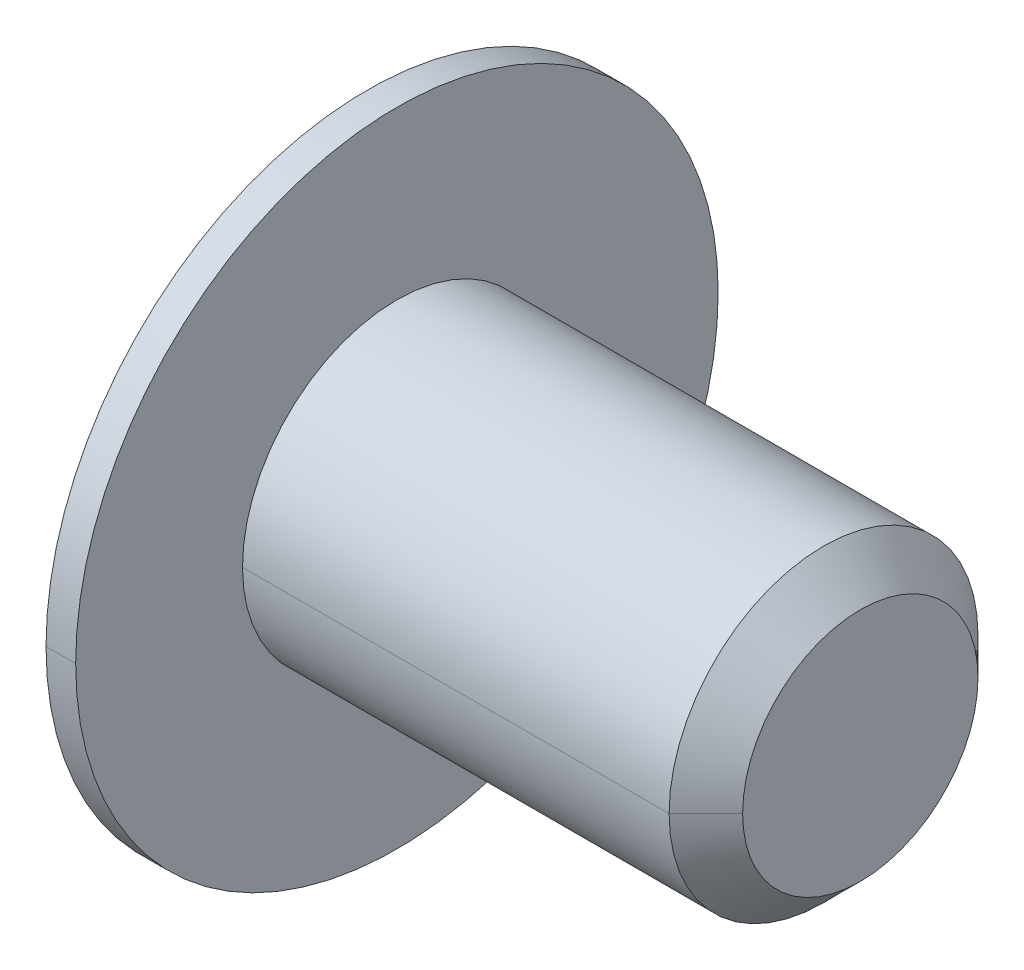
ISO-10303-21;
HEADER;
FILE_DESCRIPTION(('STEP AP214'),'2;1');
FILE_NAME('part.step','',(''),(''),'','','');
FILE_SCHEMA(('AUTOMOTIVE_DESIGN { 1 0 10303 214 1 1 1 1 }'));
ENDSEC;
DATA;
#1=APPLICATION_CONTEXT('core data for automotive mechanical design processes');
#2=APPLICATION_PROTOCOL_DEFINITION('international standard','automotive_design',2000,#1);
#3=PRODUCT_CONTEXT('',#1,'mechanical');
#4=PRODUCT('Part','Part','',(#3));
#5=PRODUCT_RELATED_PRODUCT_CATEGORY('part','',(#4));
#6=PRODUCT_DEFINITION_FORMATION('','',#4);
#7=PRODUCT_DEFINITION_CONTEXT('part definition',#1,'design');
#8=PRODUCT_DEFINITION('design','',#6,#7);
#9=PRODUCT_DEFINITION_SHAPE('','',#8);
#10=(LENGTH_UNIT() NAMED_UNIT(*) SI_UNIT(.MILLI.,.METRE.));
#11=(NAMED_UNIT(*) PLANE_ANGLE_UNIT() SI_UNIT($,.RADIAN.));
#12=(NAMED_UNIT(*) SI_UNIT($,.STERADIAN.) SOLID_ANGLE_UNIT());
#13=UNCERTAINTY_MEASURE_WITH_UNIT(LENGTH_MEASURE(1.E-05),#10,'distance_accuracy_value','');
#14=(GEOMETRIC_REPRESENTATION_CONTEXT(3) GLOBAL_UNCERTAINTY_ASSIGNED_CONTEXT((#13)) GLOBAL_UNIT_ASSIGNED_CONTEXT((#10,
#11,#12)) REPRESENTATION_CONTEXT('',''));
#15=CARTESIAN_POINT('',(0.,0.,0.));
#16=DIRECTION('',(0.,0.,1.));
#17=DIRECTION('',(1.,0.,0.));
#18=AXIS2_PLACEMENT_3D('',#15,#16,#17);
#19=CARTESIAN_POINT('',(-0.609600000000003,0.,5.9436));
#20=CARTESIAN_POINT('',(-0.609600000000003,-11.8872,5.9436));
#21=CARTESIAN_POINT('',(-0.609600000000003,-11.8872,-5.9436));
#22=CARTESIAN_POINT('',(-0.6096,0.,-5.9436));
#23=CARTESIAN_POINT('',(-1.79905906331801,0.,5.06941003668911));
#24=CARTESIAN_POINT('',(-1.79905906331801,-10.1388200733782,5.06941003668911));
#25=CARTESIAN_POINT('',(-1.79905906331801,-10.1388200733782,-5.06941003668911));
#26=CARTESIAN_POINT('',(-1.79905906331801,0.,-5.06941003668911));
#27=CARTESIAN_POINT('',(-2.64203632011339,0.,3.85763023004578));
#28=CARTESIAN_POINT('',(-2.64203632011339,-7.71526046009152,3.85763023004578));
#29=CARTESIAN_POINT('',(-2.64203632011339,-7.71526046009152,-3.85763023004578));
#30=CARTESIAN_POINT('',(-2.64203632011339,0.,-3.85763023004578));
#31=CARTESIAN_POINT('',(-3.048,0.,2.4384));
#32=CARTESIAN_POINT('',(-3.048,-4.8768,2.4384));
#33=CARTESIAN_POINT('',(-3.048,-4.8768,-2.4384));
#34=CARTESIAN_POINT('',(-3.048,0.,-2.4384));
#35=(BOUNDED_SURFACE() B_SPLINE_SURFACE(3,3,((#19,#20,#21,#22),(#23,#24,#25,#26),(#27,#28,#29,
#30),(#31,#32,#33,#34)),.UNSPECIFIED.,.F.,.F.,.F.) B_SPLINE_SURFACE_WITH_KNOTS((4,4),(4,4),(0.,
8.32527599131971),(-67.7080329892993,-44.5622516090247),
.UNSPECIFIED.) GEOMETRIC_REPRESENTATION_ITEM() RATIONAL_B_SPLINE_SURFACE(((1.,0.333333333333333,
0.333333333333333,1.),(0.9642015765525,0.3214005255175,0.3214005255175,0.9642015765525),
(0.9642015765525,0.3214005255175,0.3214005255175,0.9642015765525),(1.,0.333333333333333,
0.333333333333333,1.))) REPRESENTATION_ITEM('') SURFACE());
#36=CARTESIAN_POINT('',(-3.048,0.,0.));
#37=DIRECTION('',(1.,0.,0.));
#38=DIRECTION('',(0.,0.,-1.));
#39=AXIS2_PLACEMENT_3D('',#36,#37,#38);
#40=CIRCLE('',#39,2.4384);
#41=CARTESIAN_POINT('',(-3.048,0.,2.4384));
#42=VERTEX_POINT('',#41);
#43=CARTESIAN_POINT('',(-3.048,0.,-2.4384));
#44=VERTEX_POINT('',#43);
#45=EDGE_CURVE('E11',#42,#44,#40,.T.);
#46=CARTESIAN_POINT('',(-0.6096,0.,-5.9436));
#47=CARTESIAN_POINT('',(-1.79905906331801,0.,-5.06941003668911));
#48=CARTESIAN_POINT('',(-2.64203632011339,0.,-3.85763023004578));
#49=CARTESIAN_POINT('',(-3.048,0.,-2.4384));
#50=(BOUNDED_CURVE() B_SPLINE_CURVE(3,(#46,#47,#48,#49),.UNSPECIFIED.,.F.,
.F.) B_SPLINE_CURVE_WITH_KNOTS((4,4),(0.,8.32527599131971),
.UNSPECIFIED.) CURVE() GEOMETRIC_REPRESENTATION_ITEM() RATIONAL_B_SPLINE_CURVE((1.,
0.9642015765525,0.9642015765525,1.)) REPRESENTATION_ITEM(''));
#51=CARTESIAN_POINT('',(-0.6096,0.,-5.9436));
#52=VERTEX_POINT('',#51);
#53=EDGE_CURVE('E27',#52,#44,#50,.T.);
#54=CARTESIAN_POINT('',(-0.6096,0.,0.));
#55=DIRECTION('',(1.,0.,0.));
#56=DIRECTION('',(0.,0.,-1.));
#57=AXIS2_PLACEMENT_3D('',#54,#55,#56);
#58=CIRCLE('',#57,5.9436);
#59=CARTESIAN_POINT('',(-0.609600000000002,0.,5.9436));
#60=VERTEX_POINT('',#59);
#61=EDGE_CURVE('E327',#60,#52,#58,.T.);
#62=CARTESIAN_POINT('',(-0.609600000000003,0.,5.9436));
#63=CARTESIAN_POINT('',(-1.79905906331801,0.,5.06941003668911));
#64=CARTESIAN_POINT('',(-2.64203632011339,0.,3.85763023004578));
#65=CARTESIAN_POINT('',(-3.048,0.,2.4384));
#66=(BOUNDED_CURVE() B_SPLINE_CURVE(3,(#62,#63,#64,#65),.UNSPECIFIED.,.F.,
.F.) B_SPLINE_CURVE_WITH_KNOTS((4,4),(0.,8.32527599131971),
.UNSPECIFIED.) CURVE() GEOMETRIC_REPRESENTATION_ITEM() RATIONAL_B_SPLINE_CURVE((1.,
0.9642015765525,0.9642015765525,1.)) REPRESENTATION_ITEM(''));
#67=EDGE_CURVE('E315',#60,#42,#66,.T.);
#68=ORIENTED_EDGE('',*,*,#45,.T.);
#69=ORIENTED_EDGE('',*,*,#53,.F.);
#70=ORIENTED_EDGE('',*,*,#61,.F.);
#71=ORIENTED_EDGE('',*,*,#67,.T.);
#72=EDGE_LOOP('',(#68,#69,#70,#71));
#73=FACE_BOUND('',#72,.T.);
#74=ADVANCED_FACE('F16',(#73),#35,.T.);
#75=CARTESIAN_POINT('',(-0.6096,0.,-5.9436));
#76=CARTESIAN_POINT('',(-0.609600000000003,11.8872,-5.9436));
#77=CARTESIAN_POINT('',(-0.609600000000003,11.8872,5.9436));
#78=CARTESIAN_POINT('',(-0.609600000000003,0.,5.9436));
#79=CARTESIAN_POINT('',(-1.79905906331801,0.,-5.06941003668911));
#80=CARTESIAN_POINT('',(-1.79905906331801,10.1388200733782,-5.06941003668911));
#81=CARTESIAN_POINT('',(-1.79905906331801,10.1388200733782,5.06941003668911));
#82=CARTESIAN_POINT('',(-1.79905906331801,0.,5.06941003668911));
#83=CARTESIAN_POINT('',(-2.64203632011339,0.,-3.85763023004578));
#84=CARTESIAN_POINT('',(-2.64203632011339,7.71526046009152,-3.85763023004578));
#85=CARTESIAN_POINT('',(-2.64203632011339,7.71526046009152,3.85763023004578));
#86=CARTESIAN_POINT('',(-2.64203632011339,0.,3.85763023004578));
#87=CARTESIAN_POINT('',(-3.048,0.,-2.4384));
#88=CARTESIAN_POINT('',(-3.048,4.8768,-2.4384));
#89=CARTESIAN_POINT('',(-3.048,4.8768,2.4384));
#90=CARTESIAN_POINT('',(-3.048,0.,2.4384));
#91=(BOUNDED_SURFACE() B_SPLINE_SURFACE(3,3,((#75,#76,#77,#78),(#79,#80,#81,#82),(#83,#84,#85,
#86),(#87,#88,#89,#90)),.UNSPECIFIED.,.F.,.F.,.F.) B_SPLINE_SURFACE_WITH_KNOTS((4,4),(4,4),(0.,
8.32527599131971),(-90.8538143695747,-67.7080329893001),
.UNSPECIFIED.) GEOMETRIC_REPRESENTATION_ITEM() RATIONAL_B_SPLINE_SURFACE(((1.,0.333333333333333,
0.333333333333333,1.),(0.9642015765525,0.3214005255175,0.3214005255175,0.9642015765525),
(0.9642015765525,0.3214005255175,0.3214005255175,0.9642015765525),(1.,0.333333333333333,
0.333333333333333,1.))) REPRESENTATION_ITEM('') SURFACE());
#92=CARTESIAN_POINT('',(-0.6096,0.,0.));
#93=DIRECTION('',(1.,0.,0.));
#94=DIRECTION('',(0.,0.,-1.));
#95=AXIS2_PLACEMENT_3D('',#92,#93,#94);
#96=CIRCLE('',#95,5.9436);
#97=EDGE_CURVE('E312',#52,#60,#96,.T.);
#98=CARTESIAN_POINT('',(-3.048,0.,0.));
#99=DIRECTION('',(1.,0.,0.));
#100=DIRECTION('',(0.,0.,-1.));
#101=AXIS2_PLACEMENT_3D('',#98,#99,#100);
#102=CIRCLE('',#101,2.4384);
#103=EDGE_CURVE('E270',#44,#42,#102,.T.);
#104=ORIENTED_EDGE('',*,*,#97,.F.);
#105=ORIENTED_EDGE('',*,*,#53,.T.);
#106=ORIENTED_EDGE('',*,*,#103,.T.);
#107=ORIENTED_EDGE('',*,*,#67,.F.);
#108=EDGE_LOOP('',(#104,#105,#106,#107));
#109=FACE_BOUND('',#108,.T.);
#110=ADVANCED_FACE('F278',(#109),#91,.T.);
#111=CARTESIAN_POINT('',(-3.048,0.,0.));
#112=DIRECTION('',(1.,0.,0.));
#113=DIRECTION('',(0.,0.,-1.));
#114=AXIS2_PLACEMENT_3D('',#111,#112,#113);
#115=PLANE('',#114);
#116=ORIENTED_EDGE('',*,*,#103,.F.);
#117=ORIENTED_EDGE('',*,*,#45,.F.);
#118=EDGE_LOOP('',(#116,#117));
#119=FACE_BOUND('',#118,.T.);
#120=DIRECTION('',(0.,-1.,0.));
#121=VECTOR('',#120,1.);
#122=CARTESIAN_POINT('',(-3.048,1.1731757469933,2.032));
#123=LINE('',#122,#121);
#124=CARTESIAN_POINT('',(-3.048,1.1731757469933,2.032));
#125=VERTEX_POINT('',#124);
#126=CARTESIAN_POINT('',(-3.048,-1.1731757469933,2.032));
#127=VERTEX_POINT('',#126);
#128=EDGE_CURVE('E266',#125,#127,#123,.T.);
#129=ORIENTED_EDGE('',*,*,#128,.T.);
#130=DIRECTION('',(0.,-0.499999999999994,-0.866025403784442));
#131=VECTOR('',#130,1.);
#132=CARTESIAN_POINT('',(-3.048,-1.1731757469933,2.032));
#133=LINE('',#132,#131);
#134=CARTESIAN_POINT('',(-3.048,-2.3463514939866,0.));
#135=VERTEX_POINT('',#134);
#136=EDGE_CURVE('E262',#127,#135,#133,.T.);
#137=ORIENTED_EDGE('',*,*,#136,.T.);
#138=DIRECTION('',(0.,0.499999999999994,-0.866025403784442));
#139=VECTOR('',#138,1.);
#140=CARTESIAN_POINT('',(-3.048,-2.3463514939866,0.));
#141=LINE('',#140,#139);
#142=CARTESIAN_POINT('',(-3.048,-1.1731757469933,-2.032));
#143=VERTEX_POINT('',#142);
#144=EDGE_CURVE('E258',#135,#143,#141,.T.);
#145=ORIENTED_EDGE('',*,*,#144,.T.);
#146=DIRECTION('',(0.,1.,0.));
#147=VECTOR('',#146,1.);
#148=CARTESIAN_POINT('',(-3.048,-1.1731757469933,-2.032));
#149=LINE('',#148,#147);
#150=CARTESIAN_POINT('',(-3.048,1.1731757469933,-2.032));
#151=VERTEX_POINT('',#150);
#152=EDGE_CURVE('E254',#143,#151,#149,.T.);
#153=ORIENTED_EDGE('',*,*,#152,.T.);
#154=DIRECTION('',(0.,0.499999999999994,0.866025403784442));
#155=VECTOR('',#154,1.);
#156=CARTESIAN_POINT('',(-3.048,1.1731757469933,-2.032));
#157=LINE('',#156,#155);
#158=CARTESIAN_POINT('',(-3.048,2.3463514939866,0.));
#159=VERTEX_POINT('',#158);
#160=EDGE_CURVE('E250',#151,#159,#157,.T.);
#161=ORIENTED_EDGE('',*,*,#160,.T.);
#162=DIRECTION('',(0.,-0.499999999999994,0.866025403784442));
#163=VECTOR('',#162,1.);
#164=CARTESIAN_POINT('',(-3.048,2.3463514939866,0.));
#165=LINE('',#164,#163);
#166=EDGE_CURVE('E246',#159,#125,#165,.T.);
#167=ORIENTED_EDGE('',*,*,#166,.T.);
#168=EDGE_LOOP('',(#129,#137,#145,#153,#161,#167));
#169=FACE_BOUND('',#168,.T.);
#170=ADVANCED_FACE('F289',(#119,#169),#115,.F.);
#171=CARTESIAN_POINT('',(-0.762,2.3463514939866,0.));
#172=DIRECTION('',(0.,-0.866025403784442,-0.499999999999994));
#173=DIRECTION('',(0.,0.499999999999994,-0.866025403784442));
#174=AXIS2_PLACEMENT_3D('',#171,#172,#173);
#175=PLANE('',#174);
#176=ORIENTED_EDGE('',*,*,#166,.F.);
#177=DIRECTION('',(-1.,0.,0.));
#178=VECTOR('',#177,1.);
#179=CARTESIAN_POINT('',(-0.762,2.3463514939866,0.));
#180=LINE('',#179,#178);
#181=CARTESIAN_POINT('',(-0.762,2.3463514939866,0.));
#182=VERTEX_POINT('',#181);
#183=EDGE_CURVE('E241',#182,#159,#180,.T.);
#184=ORIENTED_EDGE('',*,*,#183,.F.);
#185=DIRECTION('',(0.,-0.499999999999994,0.866025403784442));
#186=VECTOR('',#185,1.);
#187=CARTESIAN_POINT('',(-0.762,2.3463514939866,0.));
#188=LINE('',#187,#186);
#189=CARTESIAN_POINT('',(-0.762,1.1731757469933,2.032));
#190=VERTEX_POINT('',#189);
#191=EDGE_CURVE('E237',#182,#190,#188,.T.);
#192=ORIENTED_EDGE('',*,*,#191,.T.);
#193=DIRECTION('',(-1.,0.,0.));
#194=VECTOR('',#193,1.);
#195=CARTESIAN_POINT('',(-0.762,1.1731757469933,2.032));
#196=LINE('',#195,#194);
#197=EDGE_CURVE('E232',#190,#125,#196,.T.);
#198=ORIENTED_EDGE('',*,*,#197,.T.);
#199=EDGE_LOOP('',(#176,#184,#192,#198));
#200=FACE_BOUND('',#199,.T.);
#201=ADVANCED_FACE('F344',(#200),#175,.T.);
#202=CARTESIAN_POINT('',(-0.762,1.1731757469933,2.032));
#203=DIRECTION('',(0.,0.,-1.));
#204=DIRECTION('',(-1.,0.,0.));
#205=AXIS2_PLACEMENT_3D('',#202,#203,#204);
#206=PLANE('',#205);
#207=ORIENTED_EDGE('',*,*,#128,.F.);
#208=ORIENTED_EDGE('',*,*,#197,.F.);
#209=DIRECTION('',(0.,-1.,0.));
#210=VECTOR('',#209,1.);
#211=CARTESIAN_POINT('',(-0.762,1.1731757469933,2.032));
#212=LINE('',#211,#210);
#213=CARTESIAN_POINT('',(-0.762,-1.1731757469933,2.032));
#214=VERTEX_POINT('',#213);
#215=EDGE_CURVE('E228',#190,#214,#212,.T.);
#216=ORIENTED_EDGE('',*,*,#215,.T.);
#217=DIRECTION('',(-1.,0.,0.));
#218=VECTOR('',#217,1.);
#219=CARTESIAN_POINT('',(-0.762,-1.1731757469933,2.032));
#220=LINE('',#219,#218);
#221=EDGE_CURVE('E223',#214,#127,#220,.T.);
#222=ORIENTED_EDGE('',*,*,#221,.T.);
#223=EDGE_LOOP('',(#207,#208,#216,#222));
#224=FACE_BOUND('',#223,.T.);
#225=ADVANCED_FACE('F351',(#224),#206,.T.);
#226=CARTESIAN_POINT('',(-0.762,-1.1731757469933,2.032));
#227=DIRECTION('',(0.,0.866025403784442,-0.499999999999994));
#228=DIRECTION('',(0.,0.499999999999994,0.866025403784442));
#229=AXIS2_PLACEMENT_3D('',#226,#227,#228);
#230=PLANE('',#229);
#231=ORIENTED_EDGE('',*,*,#136,.F.);
#232=ORIENTED_EDGE('',*,*,#221,.F.);
#233=DIRECTION('',(0.,-0.499999999999994,-0.866025403784442));
#234=VECTOR('',#233,1.);
#235=CARTESIAN_POINT('',(-0.762,-1.1731757469933,2.032));
#236=LINE('',#235,#234);
#237=CARTESIAN_POINT('',(-0.762,-2.3463514939866,0.));
#238=VERTEX_POINT('',#237);
#239=EDGE_CURVE('E219',#214,#238,#236,.T.);
#240=ORIENTED_EDGE('',*,*,#239,.T.);
#241=DIRECTION('',(-1.,0.,0.));
#242=VECTOR('',#241,1.);
#243=CARTESIAN_POINT('',(-0.762,-2.3463514939866,0.));
#244=LINE('',#243,#242);
#245=EDGE_CURVE('E214',#238,#135,#244,.T.);
#246=ORIENTED_EDGE('',*,*,#245,.T.);
#247=EDGE_LOOP('',(#231,#232,#240,#246));
#248=FACE_BOUND('',#247,.T.);
#249=ADVANCED_FACE('F355',(#248),#230,.T.);
#250=CARTESIAN_POINT('',(-0.762,-2.3463514939866,0.));
#251=DIRECTION('',(0.,0.866025403784442,0.499999999999994));
#252=DIRECTION('',(0.,-0.499999999999994,0.866025403784442));
#253=AXIS2_PLACEMENT_3D('',#250,#251,#252);
#254=PLANE('',#253);
#255=ORIENTED_EDGE('',*,*,#144,.F.);
#256=ORIENTED_EDGE('',*,*,#245,.F.);
#257=DIRECTION('',(0.,0.499999999999994,-0.866025403784442));
#258=VECTOR('',#257,1.);
#259=CARTESIAN_POINT('',(-0.762,-2.3463514939866,0.));
#260=LINE('',#259,#258);
#261=CARTESIAN_POINT('',(-0.762,-1.1731757469933,-2.032));
#262=VERTEX_POINT('',#261);
#263=EDGE_CURVE('E210',#238,#262,#260,.T.);
#264=ORIENTED_EDGE('',*,*,#263,.T.);
#265=DIRECTION('',(-1.,0.,0.));
#266=VECTOR('',#265,1.);
#267=CARTESIAN_POINT('',(-0.762,-1.1731757469933,-2.032));
#268=LINE('',#267,#266);
#269=EDGE_CURVE('E205',#262,#143,#268,.T.);
#270=ORIENTED_EDGE('',*,*,#269,.T.);
#271=EDGE_LOOP('',(#255,#256,#264,#270));
#272=FACE_BOUND('',#271,.T.);
#273=ADVANCED_FACE('F360',(#272),#254,.T.);
#274=CARTESIAN_POINT('',(-0.762,-1.1731757469933,-2.032));
#275=DIRECTION('',(0.,0.,1.));
#276=DIRECTION('',(1.,0.,0.));
#277=AXIS2_PLACEMENT_3D('',#274,#275,#276);
#278=PLANE('',#277);
#279=ORIENTED_EDGE('',*,*,#152,.F.);
#280=ORIENTED_EDGE('',*,*,#269,.F.);
#281=DIRECTION('',(0.,1.,0.));
#282=VECTOR('',#281,1.);
#283=CARTESIAN_POINT('',(-0.762,-1.1731757469933,-2.032));
#284=LINE('',#283,#282);
#285=CARTESIAN_POINT('',(-0.762,1.1731757469933,-2.032));
#286=VERTEX_POINT('',#285);
#287=EDGE_CURVE('E201',#262,#286,#284,.T.);
#288=ORIENTED_EDGE('',*,*,#287,.T.);
#289=DIRECTION('',(-1.,0.,0.));
#290=VECTOR('',#289,1.);
#291=CARTESIAN_POINT('',(-0.762,1.1731757469933,-2.032));
#292=LINE('',#291,#290);
#293=EDGE_CURVE('E196',#286,#151,#292,.T.);
#294=ORIENTED_EDGE('',*,*,#293,.T.);
#295=EDGE_LOOP('',(#279,#280,#288,#294));
#296=FACE_BOUND('',#295,.T.);
#297=ADVANCED_FACE('F366',(#296),#278,.T.);
#298=CARTESIAN_POINT('',(-0.762,1.1731757469933,-2.032));
#299=DIRECTION('',(0.,-0.866025403784442,0.499999999999994));
#300=DIRECTION('',(0.,-0.499999999999994,-0.866025403784442));
#301=AXIS2_PLACEMENT_3D('',#298,#299,#300);
#302=PLANE('',#301);
#303=ORIENTED_EDGE('',*,*,#160,.F.);
#304=ORIENTED_EDGE('',*,*,#293,.F.);
#305=DIRECTION('',(0.,0.499999999999994,0.866025403784442));
#306=VECTOR('',#305,1.);
#307=CARTESIAN_POINT('',(-0.762,1.1731757469933,-2.032));
#308=LINE('',#307,#306);
#309=EDGE_CURVE('E191',#286,#182,#308,.T.);
#310=ORIENTED_EDGE('',*,*,#309,.T.);
#311=ORIENTED_EDGE('',*,*,#183,.T.);
#312=EDGE_LOOP('',(#303,#304,#310,#311));
#313=FACE_BOUND('',#312,.T.);
#314=ADVANCED_FACE('F370',(#313),#302,.T.);
#315=CARTESIAN_POINT('',(-0.762,0.,0.));
#316=DIRECTION('',(1.,0.,0.));
#317=DIRECTION('',(0.,0.,-1.));
#318=AXIS2_PLACEMENT_3D('',#315,#316,#317);
#319=PLANE('',#318);
#320=ORIENTED_EDGE('',*,*,#215,.F.);
#321=ORIENTED_EDGE('',*,*,#191,.F.);
#322=ORIENTED_EDGE('',*,*,#309,.F.);
#323=ORIENTED_EDGE('',*,*,#287,.F.);
#324=ORIENTED_EDGE('',*,*,#263,.F.);
#325=ORIENTED_EDGE('',*,*,#239,.F.);
#326=EDGE_LOOP('',(#320,#321,#322,#323,#324,#325));
#327=FACE_BOUND('',#326,.T.);
#328=ADVANCED_FACE('F374',(#327),#319,.F.);
#329=CARTESIAN_POINT('',(-0.6096,5.9436,0.));
#330=DIRECTION('',(1.,0.,0.));
#331=DIRECTION('',(0.,0.,-1.));
#332=AXIS2_PLACEMENT_3D('',#329,#330,#331);
#333=PLANE('',#332);
#334=CARTESIAN_POINT('',(-0.6096,0.,0.));
#335=DIRECTION('',(1.,0.,0.));
#336=DIRECTION('',(0.,0.,-1.));
#337=AXIS2_PLACEMENT_3D('',#334,#335,#336);
#338=CIRCLE('',#337,6.604);
#339=CARTESIAN_POINT('',(-0.6096,0.,-6.604));
#340=VERTEX_POINT('',#339);
#341=CARTESIAN_POINT('',(-0.6096,0.,6.604));
#342=VERTEX_POINT('',#341);
#343=EDGE_CURVE('E186',#340,#342,#338,.T.);
#344=ORIENTED_EDGE('',*,*,#343,.F.);
#345=CARTESIAN_POINT('',(-0.6096,0.,0.));
#346=DIRECTION('',(1.,0.,0.));
#347=DIRECTION('',(0.,0.,-1.));
#348=AXIS2_PLACEMENT_3D('',#345,#346,#347);
#349=CIRCLE('',#348,6.604);
#350=EDGE_CURVE('E181',#342,#340,#349,.T.);
#351=ORIENTED_EDGE('',*,*,#350,.F.);
#352=EDGE_LOOP('',(#344,#351));
#353=FACE_BOUND('',#352,.T.);
#354=ORIENTED_EDGE('',*,*,#97,.T.);
#355=ORIENTED_EDGE('',*,*,#61,.T.);
#356=EDGE_LOOP('',(#354,#355));
#357=FACE_BOUND('',#356,.T.);
#358=ADVANCED_FACE('F340',(#353,#357),#333,.F.);
#359=CARTESIAN_POINT('',(9.525,0.,0.));
#360=DIRECTION('',(-1.,0.,0.));
#361=DIRECTION('',(0.,1.,0.));
#362=AXIS2_PLACEMENT_3D('',#359,#360,#361);
#363=CYLINDRICAL_SURFACE('',#362,6.604);
#364=ORIENTED_EDGE('',*,*,#350,.T.);
#365=DIRECTION('',(-1.,0.,0.));
#366=VECTOR('',#365,1.);
#367=CARTESIAN_POINT('',(0.,0.,-6.604));
#368=LINE('',#367,#366);
#369=CARTESIAN_POINT('',(0.,0.,-6.604));
#370=VERTEX_POINT('',#369);
#371=EDGE_CURVE('E176',#370,#340,#368,.T.);
#372=ORIENTED_EDGE('',*,*,#371,.F.);
#373=CARTESIAN_POINT('',(0.,0.,0.));
#374=DIRECTION('',(1.,0.,0.));
#375=DIRECTION('',(0.,0.,-1.));
#376=AXIS2_PLACEMENT_3D('',#373,#374,#375);
#377=CIRCLE('',#376,6.604);
#378=CARTESIAN_POINT('',(0.,0.,6.604));
#379=VERTEX_POINT('',#378);
#380=EDGE_CURVE('E171',#379,#370,#377,.T.);
#381=ORIENTED_EDGE('',*,*,#380,.F.);
#382=DIRECTION('',(-1.,0.,0.));
#383=VECTOR('',#382,1.);
#384=CARTESIAN_POINT('',(0.,0.,6.604));
#385=LINE('',#384,#383);
#386=EDGE_CURVE('E166',#379,#342,#385,.T.);
#387=ORIENTED_EDGE('',*,*,#386,.T.);
#388=EDGE_LOOP('',(#364,#372,#381,#387));
#389=FACE_BOUND('',#388,.T.);
#390=ADVANCED_FACE('F382',(#389),#363,.T.);
#391=CARTESIAN_POINT('',(9.525,0.,0.));
#392=DIRECTION('',(-1.,0.,0.));
#393=DIRECTION('',(0.,-1.,0.));
#394=AXIS2_PLACEMENT_3D('',#391,#392,#393);
#395=CYLINDRICAL_SURFACE('',#394,6.604);
#396=CARTESIAN_POINT('',(0.,0.,0.));
#397=DIRECTION('',(1.,0.,0.));
#398=DIRECTION('',(0.,0.,-1.));
#399=AXIS2_PLACEMENT_3D('',#396,#397,#398);
#400=CIRCLE('',#399,6.604);
#401=EDGE_CURVE('E161',#370,#379,#400,.T.);
#402=ORIENTED_EDGE('',*,*,#401,.F.);
#403=ORIENTED_EDGE('',*,*,#371,.T.);
#404=ORIENTED_EDGE('',*,*,#343,.T.);
#405=ORIENTED_EDGE('',*,*,#386,.F.);
#406=EDGE_LOOP('',(#402,#403,#404,#405));
#407=FACE_BOUND('',#406,.T.);
#408=ADVANCED_FACE('F454',(#407),#395,.T.);
#409=CARTESIAN_POINT('',(0.,6.604,0.));
#410=DIRECTION('',(-1.,0.,0.));
#411=DIRECTION('',(0.,0.,1.));
#412=AXIS2_PLACEMENT_3D('',#409,#410,#411);
#413=PLANE('',#412);
#414=CARTESIAN_POINT('',(0.,0.,0.));
#415=DIRECTION('',(1.,0.,0.));
#416=DIRECTION('',(0.,0.,-1.));
#417=AXIS2_PLACEMENT_3D('',#414,#415,#416);
#418=CIRCLE('',#417,3.175);
#419=CARTESIAN_POINT('',(0.,0.,-3.175));
#420=VERTEX_POINT('',#419);
#421=CARTESIAN_POINT('',(0.,0.,3.175));
#422=VERTEX_POINT('',#421);
#423=EDGE_CURVE('E156',#420,#422,#418,.T.);
#424=ORIENTED_EDGE('',*,*,#423,.F.);
#425=CARTESIAN_POINT('',(0.,0.,0.));
#426=DIRECTION('',(1.,0.,0.));
#427=DIRECTION('',(0.,0.,-1.));
#428=AXIS2_PLACEMENT_3D('',#425,#426,#427);
#429=CIRCLE('',#428,3.175);
#430=EDGE_CURVE('E151',#422,#420,#429,.T.);
#431=ORIENTED_EDGE('',*,*,#430,.F.);
#432=EDGE_LOOP('',(#424,#431));
#433=FACE_BOUND('',#432,.T.);
#434=ORIENTED_EDGE('',*,*,#401,.T.);
#435=ORIENTED_EDGE('',*,*,#380,.T.);
#436=EDGE_LOOP('',(#434,#435));
#437=FACE_BOUND('',#436,.T.);
#438=ADVANCED_FACE('F464',(#433,#437),#413,.F.);
#439=CARTESIAN_POINT('',(9.525,0.,0.));
#440=DIRECTION('',(-1.,0.,0.));
#441=DIRECTION('',(0.,1.,0.));
#442=AXIS2_PLACEMENT_3D('',#439,#440,#441);
#443=CYLINDRICAL_SURFACE('',#442,3.175);
#444=ORIENTED_EDGE('',*,*,#430,.T.);
#445=DIRECTION('',(-1.,0.,0.));
#446=VECTOR('',#445,1.);
#447=CARTESIAN_POINT('',(8.76935,0.,-3.175));
#448=LINE('',#447,#446);
#449=CARTESIAN_POINT('',(8.76935,0.,-3.175));
#450=VERTEX_POINT('',#449);
#451=EDGE_CURVE('E146',#450,#420,#448,.T.);
#452=ORIENTED_EDGE('',*,*,#451,.F.);
#453=CARTESIAN_POINT('',(8.76935,0.,0.));
#454=DIRECTION('',(1.,0.,0.));
#455=DIRECTION('',(0.,0.,-1.));
#456=AXIS2_PLACEMENT_3D('',#453,#454,#455);
#457=CIRCLE('',#456,3.175);
#458=CARTESIAN_POINT('',(8.76935,0.,3.175));
#459=VERTEX_POINT('',#458);
#460=EDGE_CURVE('E142',#459,#450,#457,.T.);
#461=ORIENTED_EDGE('',*,*,#460,.F.);
#462=DIRECTION('',(-1.,0.,0.));
#463=VECTOR('',#462,1.);
#464=CARTESIAN_POINT('',(8.76935,0.,3.175));
#465=LINE('',#464,#463);
#466=EDGE_CURVE('E130',#459,#422,#465,.T.);
#467=ORIENTED_EDGE('',*,*,#466,.T.);
#468=EDGE_LOOP('',(#444,#452,#461,#467));
#469=FACE_BOUND('',#468,.T.);
#470=ADVANCED_FACE('F474',(#469),#443,.T.);
#471=CARTESIAN_POINT('',(9.525,0.,0.));
#472=DIRECTION('',(-1.,0.,0.));
#473=DIRECTION('',(0.,-1.,0.));
#474=AXIS2_PLACEMENT_3D('',#471,#472,#473);
#475=CYLINDRICAL_SURFACE('',#474,3.175);
#476=CARTESIAN_POINT('',(8.76935,0.,0.));
#477=DIRECTION('',(1.,0.,0.));
#478=DIRECTION('',(0.,0.,-1.));
#479=AXIS2_PLACEMENT_3D('',#476,#477,#478);
#480=CIRCLE('',#479,3.175);
#481=EDGE_CURVE('E118',#450,#459,#480,.T.);
#482=ORIENTED_EDGE('',*,*,#481,.F.);
#483=ORIENTED_EDGE('',*,*,#451,.T.);
#484=ORIENTED_EDGE('',*,*,#423,.T.);
#485=ORIENTED_EDGE('',*,*,#466,.F.);
#486=EDGE_LOOP('',(#482,#483,#484,#485));
#487=FACE_BOUND('',#486,.T.);
#488=ADVANCED_FACE('F484',(#487),#475,.T.);
#489=CARTESIAN_POINT('',(8.76935,0.,0.));
#490=DIRECTION('',(-1.,0.,0.));
#491=DIRECTION('',(0.,-1.,0.));
#492=AXIS2_PLACEMENT_3D('',#489,#490,#491);
#493=CONICAL_SURFACE('',#492,3.175,0.7853981634);
#494=CARTESIAN_POINT('',(9.525,0.,0.));
#495=DIRECTION('',(1.,0.,0.));
#496=DIRECTION('',(0.,0.,-1.));
#497=AXIS2_PLACEMENT_3D('',#494,#495,#496);
#498=CIRCLE('',#497,2.41935);
#499=CARTESIAN_POINT('',(9.525,0.,-2.41935));
#500=VERTEX_POINT('',#499);
#501=CARTESIAN_POINT('',(9.52499999999807,0.,2.41934999999807));
#502=VERTEX_POINT('',#501);
#503=EDGE_CURVE('E115',#500,#502,#498,.T.);
#504=ORIENTED_EDGE('',*,*,#503,.F.);
#505=DIRECTION('',(-0.707106781184744,0.,-0.707106781188351));
#506=VECTOR('',#505,1.);
#507=CARTESIAN_POINT('',(9.52499999999807,0.,-2.41934999999807));
#508=LINE('',#507,#506);
#509=EDGE_CURVE('E121',#500,#450,#508,.T.);
#510=ORIENTED_EDGE('',*,*,#509,.T.);
#511=ORIENTED_EDGE('',*,*,#481,.T.);
#512=DIRECTION('',(-0.707106781184744,0.,0.707106781188351));
#513=VECTOR('',#512,1.);
#514=CARTESIAN_POINT('',(9.52499999999807,0.,2.41934999999807));
#515=LINE('',#514,#513);
#516=EDGE_CURVE('E110',#502,#459,#515,.T.);
#517=ORIENTED_EDGE('',*,*,#516,.F.);
#518=EDGE_LOOP('',(#504,#510,#511,#517));
#519=FACE_BOUND('',#518,.T.);
#520=ADVANCED_FACE('F112',(#519),#493,.T.);
#521=CARTESIAN_POINT('',(8.76935,0.,0.));
#522=DIRECTION('',(-1.,0.,0.));
#523=DIRECTION('',(0.,1.,0.));
#524=AXIS2_PLACEMENT_3D('',#521,#522,#523);
#525=CONICAL_SURFACE('',#524,3.175,0.7853981634);
#526=ORIENTED_EDGE('',*,*,#460,.T.);
#527=ORIENTED_EDGE('',*,*,#509,.F.);
#528=CARTESIAN_POINT('',(9.525,0.,0.));
#529=DIRECTION('',(1.,0.,0.));
#530=DIRECTION('',(0.,0.,-1.));
#531=AXIS2_PLACEMENT_3D('',#528,#529,#530);
#532=CIRCLE('',#531,2.41935);
#533=EDGE_CURVE('E122',#502,#500,#532,.T.);
#534=ORIENTED_EDGE('',*,*,#533,.F.);
#535=ORIENTED_EDGE('',*,*,#516,.T.);
#536=EDGE_LOOP('',(#526,#527,#534,#535));
#537=FACE_BOUND('',#536,.T.);
#538=ADVANCED_FACE('F125',(#537),#525,.T.);
#539=CARTESIAN_POINT('',(9.525,2.41935,0.));
#540=DIRECTION('',(-1.,0.,0.));
#541=DIRECTION('',(0.,0.,1.));
#542=AXIS2_PLACEMENT_3D('',#539,#540,#541);
#543=PLANE('',#542);
#544=ORIENTED_EDGE('',*,*,#503,.T.);
#545=ORIENTED_EDGE('',*,*,#533,.T.);
#546=EDGE_LOOP('',(#544,#545));
#547=FACE_BOUND('',#546,.T.);
#548=ADVANCED_FACE('F128',(#547),#543,.F.);
#549=CLOSED_SHELL('',(#74,#110,#170,#201,#225,#249,#273,#297,#314,#328,#358,#390,#408,#438,#470,
#488,#520,#538,#548));
#550=MANIFOLD_SOLID_BREP('B1',#549);
#551=ADVANCED_BREP_SHAPE_REPRESENTATION('',(#18,#550),#14);
#552=SHAPE_DEFINITION_REPRESENTATION(#9,#551);
ENDSEC;
END-ISO-10303-21;
